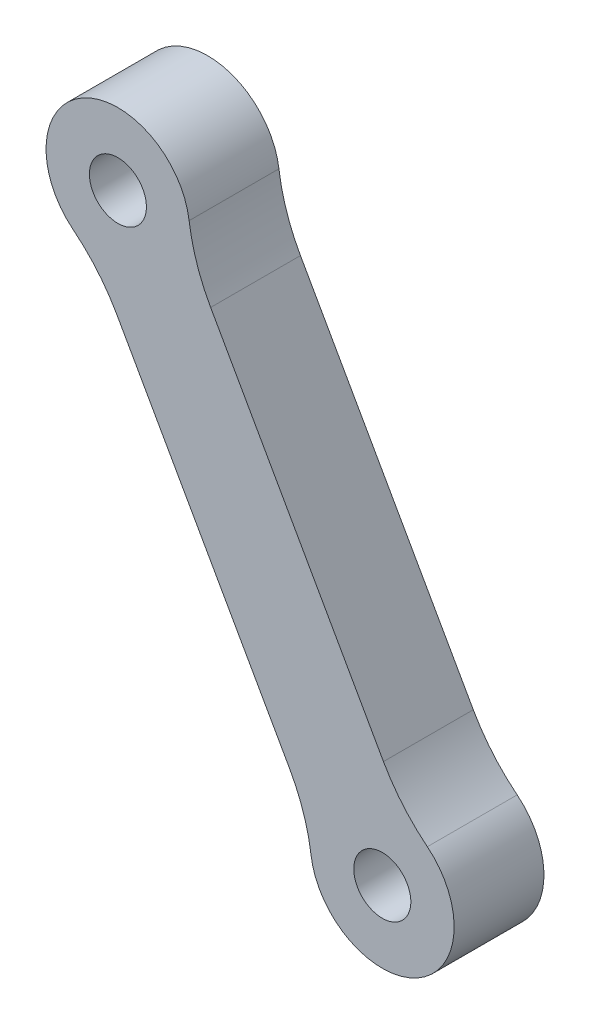
ISO-10303-21;
HEADER;
FILE_DESCRIPTION(('STEP AP214'),'2;1');
FILE_NAME('part.step','',(''),(''),'','','');
FILE_SCHEMA(('AUTOMOTIVE_DESIGN { 1 0 10303 214 1 1 1 1 }'));
ENDSEC;
DATA;
#1=APPLICATION_CONTEXT('core data for automotive mechanical design processes');
#2=APPLICATION_PROTOCOL_DEFINITION('international standard','automotive_design',2000,#1);
#3=PRODUCT_CONTEXT('',#1,'mechanical');
#4=PRODUCT('Part','Part','',(#3));
#5=PRODUCT_RELATED_PRODUCT_CATEGORY('part','',(#4));
#6=PRODUCT_DEFINITION_FORMATION('','',#4);
#7=PRODUCT_DEFINITION_CONTEXT('part definition',#1,'design');
#8=PRODUCT_DEFINITION('design','',#6,#7);
#9=PRODUCT_DEFINITION_SHAPE('','',#8);
#10=(LENGTH_UNIT() NAMED_UNIT(*) SI_UNIT(.MILLI.,.METRE.));
#11=(NAMED_UNIT(*) PLANE_ANGLE_UNIT() SI_UNIT($,.RADIAN.));
#12=(NAMED_UNIT(*) SI_UNIT($,.STERADIAN.) SOLID_ANGLE_UNIT());
#13=UNCERTAINTY_MEASURE_WITH_UNIT(LENGTH_MEASURE(1.E-05),#10,'distance_accuracy_value','');
#14=(GEOMETRIC_REPRESENTATION_CONTEXT(3) GLOBAL_UNCERTAINTY_ASSIGNED_CONTEXT((#13)) GLOBAL_UNIT_ASSIGNED_CONTEXT((#10,
#11,#12)) REPRESENTATION_CONTEXT('',''));
#15=CARTESIAN_POINT('',(0.,0.,0.));
#16=DIRECTION('',(0.,0.,1.));
#17=DIRECTION('',(1.,0.,0.));
#18=AXIS2_PLACEMENT_3D('',#15,#16,#17);
#19=CARTESIAN_POINT('',(-0.531717418692566,-21.5120788638868,58.));
#20=DIRECTION('',(0.,0.,1.));
#21=DIRECTION('',(1.,0.,0.));
#22=AXIS2_PLACEMENT_3D('',#19,#20,#21);
#23=CYLINDRICAL_SURFACE('',#22,10.);
#24=CARTESIAN_POINT('',(-0.531717418692566,-21.5120788638868,63.));
#25=DIRECTION('',(0.,0.,-1.));
#26=DIRECTION('',(-1.,0.,0.));
#27=AXIS2_PLACEMENT_3D('',#24,#25,#26);
#28=CIRCLE('',#27,10.);
#29=CARTESIAN_POINT('',(5.73851095756384,-13.7220701277179,63.));
#30=VERTEX_POINT('',#29);
#31=CARTESIAN_POINT('',(8.18192841407054,-16.6057180637448,63.));
#32=VERTEX_POINT('',#31);
#33=EDGE_CURVE('E134',#30,#32,#28,.T.);
#34=ORIENTED_EDGE('',*,*,#33,.F.);
#35=DIRECTION('',(0.,0.,1.));
#36=VECTOR('',#35,1.);
#37=CARTESIAN_POINT('',(5.73851095756384,-13.7220701277179,58.));
#38=LINE('',#37,#36);
#39=CARTESIAN_POINT('',(5.73851095756384,-13.7220701277179,58.));
#40=VERTEX_POINT('',#39);
#41=EDGE_CURVE('E11',#40,#30,#38,.T.);
#42=ORIENTED_EDGE('',*,*,#41,.F.);
#43=CARTESIAN_POINT('',(-0.531717418692566,-21.5120788638868,58.));
#44=DIRECTION('',(0.,0.,-1.));
#45=DIRECTION('',(-1.,0.,0.));
#46=AXIS2_PLACEMENT_3D('',#43,#44,#45);
#47=CIRCLE('',#46,10.);
#48=CARTESIAN_POINT('',(8.18192841407054,-16.6057180637448,58.));
#49=VERTEX_POINT('',#48);
#50=EDGE_CURVE('E155',#40,#49,#47,.T.);
#51=ORIENTED_EDGE('',*,*,#50,.T.);
#52=DIRECTION('',(0.,0.,1.));
#53=VECTOR('',#52,1.);
#54=CARTESIAN_POINT('',(8.18192841407054,-16.6057180637448,58.));
#55=LINE('',#54,#53);
#56=EDGE_CURVE('E39',#49,#32,#55,.T.);
#57=ORIENTED_EDGE('',*,*,#56,.T.);
#58=EDGE_LOOP('',(#34,#42,#51,#57));
#59=FACE_BOUND('',#58,.T.);
#60=ADVANCED_FACE('F36',(#59),#23,.F.);
#61=CARTESIAN_POINT('',(8.24660230806642,-10.6060666332503,58.));
#62=DIRECTION('',(0.,0.,1.));
#63=DIRECTION('',(1.,0.,0.));
#64=AXIS2_PLACEMENT_3D('',#61,#62,#63);
#65=CYLINDRICAL_SURFACE('',#64,3.99999999999999);
#66=CARTESIAN_POINT('',(8.24660230806642,-10.6060666332503,63.));
#67=DIRECTION('',(0.,0.,1.));
#68=DIRECTION('',(1.,0.,0.));
#69=AXIS2_PLACEMENT_3D('',#66,#67,#68);
#70=CIRCLE('',#69,3.99999999999999);
#71=CARTESIAN_POINT('',(12.2115050047593,-10.0773449618981,63.));
#72=VERTEX_POINT('',#71);
#73=EDGE_CURVE('E153',#72,#30,#70,.T.);
#74=ORIENTED_EDGE('',*,*,#73,.F.);
#75=DIRECTION('',(0.,0.,1.));
#76=VECTOR('',#75,1.);
#77=CARTESIAN_POINT('',(12.2115050047593,-10.0773449618981,58.));
#78=LINE('',#77,#76);
#79=CARTESIAN_POINT('',(12.2115050047593,-10.0773449618981,58.));
#80=VERTEX_POINT('',#79);
#81=EDGE_CURVE('E45',#80,#72,#78,.T.);
#82=ORIENTED_EDGE('',*,*,#81,.F.);
#83=CARTESIAN_POINT('',(8.24660230806642,-10.6060666332503,58.));
#84=DIRECTION('',(0.,0.,1.));
#85=DIRECTION('',(1.,0.,0.));
#86=AXIS2_PLACEMENT_3D('',#83,#84,#85);
#87=CIRCLE('',#86,3.99999999999999);
#88=EDGE_CURVE('E124',#80,#40,#87,.T.);
#89=ORIENTED_EDGE('',*,*,#88,.T.);
#90=ORIENTED_EDGE('',*,*,#41,.T.);
#91=EDGE_LOOP('',(#74,#82,#89,#90));
#92=FACE_BOUND('',#91,.T.);
#93=ADVANCED_FACE('F168',(#92),#65,.T.);
#94=CARTESIAN_POINT('',(22.1237617464915,-8.75554078351763,58.));
#95=DIRECTION('',(0.,0.,1.));
#96=DIRECTION('',(1.,0.,0.));
#97=AXIS2_PLACEMENT_3D('',#94,#95,#96);
#98=CYLINDRICAL_SURFACE('',#97,10.);
#99=CARTESIAN_POINT('',(22.1237617464915,-8.75554078351763,63.));
#100=DIRECTION('',(0.,0.,-1.));
#101=DIRECTION('',(-1.,0.,0.));
#102=AXIS2_PLACEMENT_3D('',#99,#100,#101);
#103=CIRCLE('',#102,10.);
#104=CARTESIAN_POINT('',(13.4101159137284,-13.6619015836596,63.));
#105=VERTEX_POINT('',#104);
#106=EDGE_CURVE('E110',#105,#72,#103,.T.);
#107=ORIENTED_EDGE('',*,*,#106,.F.);
#108=DIRECTION('',(0.,0.,1.));
#109=VECTOR('',#108,1.);
#110=CARTESIAN_POINT('',(13.4101159137284,-13.6619015836596,58.));
#111=LINE('',#110,#109);
#112=CARTESIAN_POINT('',(13.4101159137284,-13.6619015836596,58.));
#113=VERTEX_POINT('',#112);
#114=EDGE_CURVE('E105',#113,#105,#111,.T.);
#115=ORIENTED_EDGE('',*,*,#114,.F.);
#116=CARTESIAN_POINT('',(22.1237617464915,-8.75554078351763,58.));
#117=DIRECTION('',(0.,0.,-1.));
#118=DIRECTION('',(-1.,0.,0.));
#119=AXIS2_PLACEMENT_3D('',#116,#117,#118);
#120=CIRCLE('',#119,10.);
#121=EDGE_CURVE('E108',#113,#80,#120,.T.);
#122=ORIENTED_EDGE('',*,*,#121,.T.);
#123=ORIENTED_EDGE('',*,*,#81,.T.);
#124=EDGE_LOOP('',(#107,#115,#122,#123));
#125=FACE_BOUND('',#124,.T.);
#126=ADVANCED_FACE('F107',(#125),#98,.F.);
#127=CARTESIAN_POINT('',(23.0303586024883,-30.7473527010451,58.));
#128=DIRECTION('',(0.871364583276311,0.4906360800142,0.));
#129=DIRECTION('',(-0.4906360800142,0.871364583276311,0.));
#130=AXIS2_PLACEMENT_3D('',#127,#128,#129);
#131=PLANE('',#130);
#132=DIRECTION('',(-0.4906360800142,0.871364583276311,0.));
#133=VECTOR('',#132,1.);
#134=CARTESIAN_POINT('',(23.0303586024883,-30.7473527010451,63.));
#135=LINE('',#134,#133);
#136=CARTESIAN_POINT('',(23.0303586024883,-30.7473527010451,63.));
#137=VERTEX_POINT('',#136);
#138=EDGE_CURVE('E150',#137,#105,#135,.T.);
#139=ORIENTED_EDGE('',*,*,#138,.F.);
#140=DIRECTION('',(0.,0.,1.));
#141=VECTOR('',#140,1.);
#142=CARTESIAN_POINT('',(23.0303586024883,-30.7473527010451,58.));
#143=LINE('',#142,#141);
#144=CARTESIAN_POINT('',(23.0303586024883,-30.7473527010451,58.));
#145=VERTEX_POINT('',#144);
#146=EDGE_CURVE('E115',#145,#137,#143,.T.);
#147=ORIENTED_EDGE('',*,*,#146,.F.);
#148=DIRECTION('',(-0.4906360800142,0.871364583276311,0.));
#149=VECTOR('',#148,1.);
#150=CARTESIAN_POINT('',(23.0303586024883,-30.7473527010451,58.));
#151=LINE('',#150,#149);
#152=EDGE_CURVE('E122',#145,#113,#151,.T.);
#153=ORIENTED_EDGE('',*,*,#152,.T.);
#154=ORIENTED_EDGE('',*,*,#114,.T.);
#155=EDGE_LOOP('',(#139,#147,#153,#154));
#156=FACE_BOUND('',#155,.T.);
#157=ADVANCED_FACE('F126',(#156),#131,.T.);
#158=CARTESIAN_POINT('',(31.7440044352514,-25.8409919009031,58.));
#159=DIRECTION('',(0.,0.,1.));
#160=DIRECTION('',(1.,0.,0.));
#161=AXIS2_PLACEMENT_3D('',#158,#159,#160);
#162=CYLINDRICAL_SURFACE('',#161,10.);
#163=CARTESIAN_POINT('',(31.7440044352514,-25.8409919009031,63.));
#164=DIRECTION('',(0.,0.,-1.));
#165=DIRECTION('',(-1.,0.,0.));
#166=AXIS2_PLACEMENT_3D('',#163,#164,#165);
#167=CIRCLE('',#166,10.);
#168=CARTESIAN_POINT('',(25.473776058995,-33.631000637072,63.));
#169=VERTEX_POINT('',#168);
#170=EDGE_CURVE('E147',#169,#137,#167,.T.);
#171=ORIENTED_EDGE('',*,*,#170,.F.);
#172=DIRECTION('',(0.,0.,1.));
#173=VECTOR('',#172,1.);
#174=CARTESIAN_POINT('',(25.473776058995,-33.631000637072,58.));
#175=LINE('',#174,#173);
#176=CARTESIAN_POINT('',(25.473776058995,-33.631000637072,58.));
#177=VERTEX_POINT('',#176);
#178=EDGE_CURVE('E159',#177,#169,#175,.T.);
#179=ORIENTED_EDGE('',*,*,#178,.F.);
#180=CARTESIAN_POINT('',(31.7440044352514,-25.8409919009031,58.));
#181=DIRECTION('',(0.,0.,-1.));
#182=DIRECTION('',(-1.,0.,0.));
#183=AXIS2_PLACEMENT_3D('',#180,#181,#182);
#184=CIRCLE('',#183,10.);
#185=EDGE_CURVE('E127',#177,#145,#184,.T.);
#186=ORIENTED_EDGE('',*,*,#185,.T.);
#187=ORIENTED_EDGE('',*,*,#146,.T.);
#188=EDGE_LOOP('',(#171,#179,#186,#187));
#189=FACE_BOUND('',#188,.T.);
#190=ADVANCED_FACE('F181',(#189),#162,.F.);
#191=CARTESIAN_POINT('',(22.9656847084924,-36.7470041315396,58.));
#192=DIRECTION('',(0.,0.,1.));
#193=DIRECTION('',(1.,0.,0.));
#194=AXIS2_PLACEMENT_3D('',#191,#192,#193);
#195=CYLINDRICAL_SURFACE('',#194,4.);
#196=CARTESIAN_POINT('',(22.9656847084924,-36.7470041315396,63.));
#197=DIRECTION('',(0.,0.,1.));
#198=DIRECTION('',(1.,0.,0.));
#199=AXIS2_PLACEMENT_3D('',#196,#197,#198);
#200=CIRCLE('',#199,4.);
#201=CARTESIAN_POINT('',(19.0007820117995,-37.2757258028918,63.));
#202=VERTEX_POINT('',#201);
#203=EDGE_CURVE('E144',#202,#169,#200,.T.);
#204=ORIENTED_EDGE('',*,*,#203,.F.);
#205=DIRECTION('',(0.,0.,1.));
#206=VECTOR('',#205,1.);
#207=CARTESIAN_POINT('',(19.0007820117995,-37.2757258028918,58.));
#208=LINE('',#207,#206);
#209=CARTESIAN_POINT('',(19.0007820117995,-37.2757258028918,58.));
#210=VERTEX_POINT('',#209);
#211=EDGE_CURVE('E161',#210,#202,#208,.T.);
#212=ORIENTED_EDGE('',*,*,#211,.F.);
#213=CARTESIAN_POINT('',(22.9656847084924,-36.7470041315396,58.));
#214=DIRECTION('',(0.,0.,1.));
#215=DIRECTION('',(1.,0.,0.));
#216=AXIS2_PLACEMENT_3D('',#213,#214,#215);
#217=CIRCLE('',#216,4.);
#218=EDGE_CURVE('E129',#210,#177,#217,.T.);
#219=ORIENTED_EDGE('',*,*,#218,.T.);
#220=ORIENTED_EDGE('',*,*,#178,.T.);
#221=EDGE_LOOP('',(#204,#212,#219,#220));
#222=FACE_BOUND('',#221,.T.);
#223=ADVANCED_FACE('F184',(#222),#195,.T.);
#224=CARTESIAN_POINT('',(9.0885252700673,-38.5975299812723,58.));
#225=DIRECTION('',(0.,0.,1.));
#226=DIRECTION('',(1.,0.,0.));
#227=AXIS2_PLACEMENT_3D('',#224,#225,#226);
#228=CYLINDRICAL_SURFACE('',#227,10.);
#229=CARTESIAN_POINT('',(9.0885252700673,-38.5975299812723,63.));
#230=DIRECTION('',(0.,0.,-1.));
#231=DIRECTION('',(-1.,0.,0.));
#232=AXIS2_PLACEMENT_3D('',#229,#230,#231);
#233=CIRCLE('',#232,10.);
#234=CARTESIAN_POINT('',(17.8021711028304,-33.6911691811303,63.));
#235=VERTEX_POINT('',#234);
#236=EDGE_CURVE('E141',#235,#202,#233,.T.);
#237=ORIENTED_EDGE('',*,*,#236,.F.);
#238=DIRECTION('',(0.,0.,1.));
#239=VECTOR('',#238,1.);
#240=CARTESIAN_POINT('',(17.8021711028304,-33.6911691811303,58.));
#241=LINE('',#240,#239);
#242=CARTESIAN_POINT('',(17.8021711028304,-33.6911691811303,58.));
#243=VERTEX_POINT('',#242);
#244=EDGE_CURVE('E162',#243,#235,#241,.T.);
#245=ORIENTED_EDGE('',*,*,#244,.F.);
#246=CARTESIAN_POINT('',(9.0885252700673,-38.5975299812723,58.));
#247=DIRECTION('',(0.,0.,-1.));
#248=DIRECTION('',(-1.,0.,0.));
#249=AXIS2_PLACEMENT_3D('',#246,#247,#248);
#250=CIRCLE('',#249,10.);
#251=EDGE_CURVE('E228',#243,#210,#250,.T.);
#252=ORIENTED_EDGE('',*,*,#251,.T.);
#253=ORIENTED_EDGE('',*,*,#211,.T.);
#254=EDGE_LOOP('',(#237,#245,#252,#253));
#255=FACE_BOUND('',#254,.T.);
#256=ADVANCED_FACE('F188',(#255),#228,.F.);
#257=CARTESIAN_POINT('',(8.18192841407054,-16.6057180637448,58.));
#258=DIRECTION('',(-0.871364583276311,-0.4906360800142,0.));
#259=DIRECTION('',(0.4906360800142,-0.871364583276311,0.));
#260=AXIS2_PLACEMENT_3D('',#257,#258,#259);
#261=PLANE('',#260);
#262=DIRECTION('',(0.4906360800142,-0.871364583276311,0.));
#263=VECTOR('',#262,1.);
#264=CARTESIAN_POINT('',(8.18192841407054,-16.6057180637448,63.));
#265=LINE('',#264,#263);
#266=EDGE_CURVE('E137',#32,#235,#265,.T.);
#267=ORIENTED_EDGE('',*,*,#266,.F.);
#268=ORIENTED_EDGE('',*,*,#56,.F.);
#269=DIRECTION('',(0.4906360800142,-0.871364583276311,0.));
#270=VECTOR('',#269,1.);
#271=CARTESIAN_POINT('',(8.18192841407054,-16.6057180637448,58.));
#272=LINE('',#271,#270);
#273=EDGE_CURVE('E226',#49,#243,#272,.T.);
#274=ORIENTED_EDGE('',*,*,#273,.T.);
#275=ORIENTED_EDGE('',*,*,#244,.T.);
#276=EDGE_LOOP('',(#267,#268,#274,#275));
#277=FACE_BOUND('',#276,.T.);
#278=ADVANCED_FACE('F164',(#277),#261,.T.);
#279=CARTESIAN_POINT('',(-0.531717418692566,-21.5120788638868,58.));
#280=DIRECTION('',(0.,0.,-1.));
#281=DIRECTION('',(-1.,0.,0.));
#282=AXIS2_PLACEMENT_3D('',#279,#280,#281);
#283=PLANE('',#282);
#284=ORIENTED_EDGE('',*,*,#50,.F.);
#285=ORIENTED_EDGE('',*,*,#88,.F.);
#286=ORIENTED_EDGE('',*,*,#121,.F.);
#287=ORIENTED_EDGE('',*,*,#152,.F.);
#288=ORIENTED_EDGE('',*,*,#185,.F.);
#289=ORIENTED_EDGE('',*,*,#218,.F.);
#290=ORIENTED_EDGE('',*,*,#251,.F.);
#291=ORIENTED_EDGE('',*,*,#273,.F.);
#292=EDGE_LOOP('',(#284,#285,#286,#287,#288,#289,#290,#291));
#293=FACE_BOUND('',#292,.T.);
#294=CARTESIAN_POINT('',(22.9656847084924,-36.7470041315396,58.));
#295=DIRECTION('',(0.,0.,-1.));
#296=DIRECTION('',(-1.,0.,0.));
#297=AXIS2_PLACEMENT_3D('',#294,#295,#296);
#298=CIRCLE('',#297,1.5875);
#299=CARTESIAN_POINT('',(21.3781847084924,-36.7470041315396,58.));
#300=VERTEX_POINT('',#299);
#301=EDGE_CURVE('E218',#300,#300,#298,.T.);
#302=ORIENTED_EDGE('',*,*,#301,.F.);
#303=EDGE_LOOP('',(#302));
#304=FACE_BOUND('',#303,.T.);
#305=CARTESIAN_POINT('',(8.24660230806642,-10.6060666332503,58.));
#306=DIRECTION('',(0.,0.,-1.));
#307=DIRECTION('',(-1.,0.,0.));
#308=AXIS2_PLACEMENT_3D('',#305,#306,#307);
#309=CIRCLE('',#308,1.5875);
#310=CARTESIAN_POINT('',(6.65910230806642,-10.6060666332503,58.));
#311=VERTEX_POINT('',#310);
#312=EDGE_CURVE('E215',#311,#311,#309,.T.);
#313=ORIENTED_EDGE('',*,*,#312,.F.);
#314=EDGE_LOOP('',(#313));
#315=FACE_BOUND('',#314,.T.);
#316=ADVANCED_FACE('F119',(#293,#304,#315),#283,.T.);
#317=CARTESIAN_POINT('',(-0.531717418692566,-21.5120788638868,63.));
#318=DIRECTION('',(0.,0.,-1.));
#319=DIRECTION('',(-1.,0.,0.));
#320=AXIS2_PLACEMENT_3D('',#317,#318,#319);
#321=PLANE('',#320);
#322=ORIENTED_EDGE('',*,*,#33,.T.);
#323=ORIENTED_EDGE('',*,*,#266,.T.);
#324=ORIENTED_EDGE('',*,*,#236,.T.);
#325=ORIENTED_EDGE('',*,*,#203,.T.);
#326=ORIENTED_EDGE('',*,*,#170,.T.);
#327=ORIENTED_EDGE('',*,*,#138,.T.);
#328=ORIENTED_EDGE('',*,*,#106,.T.);
#329=ORIENTED_EDGE('',*,*,#73,.T.);
#330=EDGE_LOOP('',(#322,#323,#324,#325,#326,#327,#328,#329));
#331=FACE_BOUND('',#330,.T.);
#332=CARTESIAN_POINT('',(22.9656847084924,-36.7470041315396,63.));
#333=DIRECTION('',(0.,0.,-1.));
#334=DIRECTION('',(-1.,0.,0.));
#335=AXIS2_PLACEMENT_3D('',#332,#333,#334);
#336=CIRCLE('',#335,1.5875);
#337=CARTESIAN_POINT('',(21.3781847084924,-36.7470041315396,63.));
#338=VERTEX_POINT('',#337);
#339=EDGE_CURVE('E138',#338,#338,#336,.T.);
#340=ORIENTED_EDGE('',*,*,#339,.T.);
#341=EDGE_LOOP('',(#340));
#342=FACE_BOUND('',#341,.T.);
#343=CARTESIAN_POINT('',(8.24660230806642,-10.6060666332503,63.));
#344=DIRECTION('',(0.,0.,-1.));
#345=DIRECTION('',(-1.,0.,0.));
#346=AXIS2_PLACEMENT_3D('',#343,#344,#345);
#347=CIRCLE('',#346,1.5875);
#348=CARTESIAN_POINT('',(6.65910230806642,-10.6060666332503,63.));
#349=VERTEX_POINT('',#348);
#350=EDGE_CURVE('E212',#349,#349,#347,.T.);
#351=ORIENTED_EDGE('',*,*,#350,.T.);
#352=EDGE_LOOP('',(#351));
#353=FACE_BOUND('',#352,.T.);
#354=ADVANCED_FACE('F166',(#331,#342,#353),#321,.F.);
#355=CARTESIAN_POINT('',(22.9656847084924,-36.7470041315396,63.));
#356=DIRECTION('',(0.,0.,-1.));
#357=DIRECTION('',(-1.,0.,0.));
#358=AXIS2_PLACEMENT_3D('',#355,#356,#357);
#359=CYLINDRICAL_SURFACE('',#358,1.5875);
#360=ORIENTED_EDGE('',*,*,#339,.F.);
#361=EDGE_LOOP('',(#360));
#362=FACE_BOUND('',#361,.T.);
#363=ORIENTED_EDGE('',*,*,#301,.T.);
#364=EDGE_LOOP('',(#363));
#365=FACE_BOUND('',#364,.T.);
#366=ADVANCED_FACE('F199',(#362,#365),#359,.F.);
#367=CARTESIAN_POINT('',(8.24660230806642,-10.6060666332503,63.));
#368=DIRECTION('',(0.,0.,-1.));
#369=DIRECTION('',(-1.,0.,0.));
#370=AXIS2_PLACEMENT_3D('',#367,#368,#369);
#371=CYLINDRICAL_SURFACE('',#370,1.5875);
#372=ORIENTED_EDGE('',*,*,#350,.F.);
#373=EDGE_LOOP('',(#372));
#374=FACE_BOUND('',#373,.T.);
#375=ORIENTED_EDGE('',*,*,#312,.T.);
#376=EDGE_LOOP('',(#375));
#377=FACE_BOUND('',#376,.T.);
#378=ADVANCED_FACE('F203',(#374,#377),#371,.F.);
#379=CLOSED_SHELL('',(#60,#93,#126,#157,#190,#223,#256,#278,#316,#354,#366,#378));
#380=MANIFOLD_SOLID_BREP('B2',#379);
#381=ADVANCED_BREP_SHAPE_REPRESENTATION('',(#18,#380),#14);
#382=SHAPE_DEFINITION_REPRESENTATION(#9,#381);
ENDSEC;
END-ISO-10303-21;
